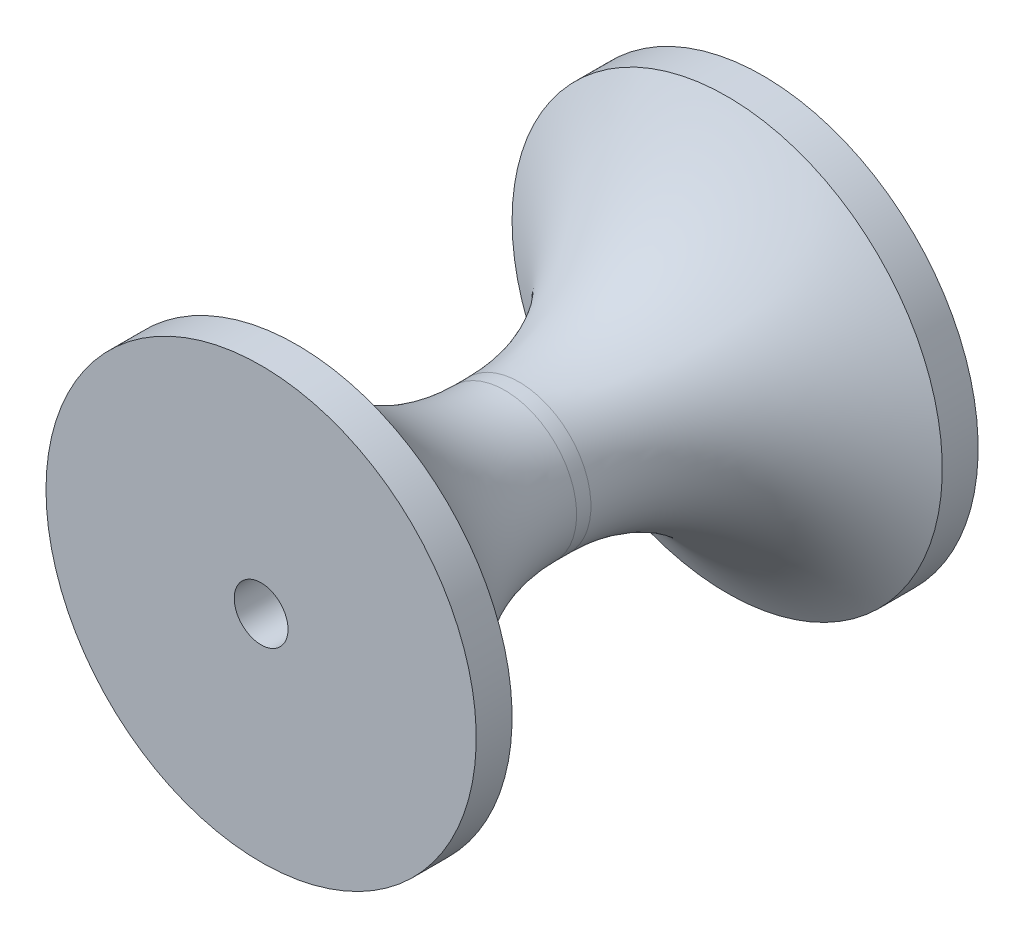
ISO-10303-21;
HEADER;
FILE_DESCRIPTION(('STEP AP214'),'2;1');
FILE_NAME('part.step','',(''),(''),'','','');
FILE_SCHEMA(('AUTOMOTIVE_DESIGN { 1 0 10303 214 1 1 1 1 }'));
ENDSEC;
DATA;
#1=APPLICATION_CONTEXT('core data for automotive mechanical design processes');
#2=APPLICATION_PROTOCOL_DEFINITION('international standard','automotive_design',2000,#1);
#3=PRODUCT_CONTEXT('',#1,'mechanical');
#4=PRODUCT('Part','Part','',(#3));
#5=PRODUCT_RELATED_PRODUCT_CATEGORY('part','',(#4));
#6=PRODUCT_DEFINITION_FORMATION('','',#4);
#7=PRODUCT_DEFINITION_CONTEXT('part definition',#1,'design');
#8=PRODUCT_DEFINITION('design','',#6,#7);
#9=PRODUCT_DEFINITION_SHAPE('','',#8);
#10=(LENGTH_UNIT() NAMED_UNIT(*) SI_UNIT(.MILLI.,.METRE.));
#11=(NAMED_UNIT(*) PLANE_ANGLE_UNIT() SI_UNIT($,.RADIAN.));
#12=(NAMED_UNIT(*) SI_UNIT($,.STERADIAN.) SOLID_ANGLE_UNIT());
#13=UNCERTAINTY_MEASURE_WITH_UNIT(LENGTH_MEASURE(1.E-05),#10,'distance_accuracy_value','');
#14=(GEOMETRIC_REPRESENTATION_CONTEXT(3) GLOBAL_UNCERTAINTY_ASSIGNED_CONTEXT((#13)) GLOBAL_UNIT_ASSIGNED_CONTEXT((#10,
#11,#12)) REPRESENTATION_CONTEXT('',''));
#15=CARTESIAN_POINT('',(0.,0.,0.));
#16=DIRECTION('',(0.,0.,1.));
#17=DIRECTION('',(1.,0.,0.));
#18=AXIS2_PLACEMENT_3D('',#15,#16,#17);
#19=CARTESIAN_POINT('',(0.,0.,-51.2368456443619));
#20=DIRECTION('',(0.,0.,-1.));
#21=DIRECTION('',(-1.,0.,0.));
#22=AXIS2_PLACEMENT_3D('',#19,#20,#21);
#23=CYLINDRICAL_SURFACE('',#22,12.7);
#24=CARTESIAN_POINT('',(0.,0.,-1.27));
#25=DIRECTION('',(0.,0.,-1.));
#26=DIRECTION('',(-1.,0.,0.));
#27=AXIS2_PLACEMENT_3D('',#24,#25,#26);
#28=CIRCLE('',#27,12.7);
#29=CARTESIAN_POINT('',(-12.7,0.,-1.27));
#30=VERTEX_POINT('',#29);
#31=EDGE_CURVE('E10',#30,#30,#28,.T.);
#32=ORIENTED_EDGE('',*,*,#31,.F.);
#33=EDGE_LOOP('',(#32));
#34=FACE_BOUND('',#33,.T.);
#35=CARTESIAN_POINT('',(0.,0.,1.27));
#36=DIRECTION('',(0.,0.,-1.));
#37=DIRECTION('',(-1.,0.,0.));
#38=AXIS2_PLACEMENT_3D('',#35,#36,#37);
#39=CIRCLE('',#38,12.7);
#40=CARTESIAN_POINT('',(-12.7,0.,1.27));
#41=VERTEX_POINT('',#40);
#42=EDGE_CURVE('E49',#41,#41,#39,.T.);
#43=ORIENTED_EDGE('',*,*,#42,.T.);
#44=EDGE_LOOP('',(#43));
#45=FACE_BOUND('',#44,.T.);
#46=ADVANCED_FACE('F35',(#34,#45),#23,.T.);
#47=CARTESIAN_POINT('',(0.,38.1,-38.1));
#48=CARTESIAN_POINT('',(0.,12.7,-23.6396667933533));
#49=CARTESIAN_POINT('',(0.,12.7,-1.27));
#50=B_SPLINE_CURVE_WITH_KNOTS('',2,(#47,#48,#49),.UNSPECIFIED.,.F.,.F.,(3,3),(0.,1.),.UNSPECIFIED.);
#51=CARTESIAN_POINT('',(0.,0.,-51.2368456443619));
#52=DIRECTION('',(0.,0.,-1.));
#53=AXIS1_PLACEMENT('',#51,#52);
#54=SURFACE_OF_REVOLUTION('',#50,#53);
#55=ORIENTED_EDGE('',*,*,#31,.T.);
#56=EDGE_LOOP('',(#55));
#57=FACE_BOUND('',#56,.T.);
#58=CARTESIAN_POINT('',(0.,0.,-38.1));
#59=DIRECTION('',(0.,0.,-1.));
#60=DIRECTION('',(-1.,0.,0.));
#61=AXIS2_PLACEMENT_3D('',#58,#59,#60);
#62=CIRCLE('',#61,38.1);
#63=CARTESIAN_POINT('',(-38.1,0.,-38.1));
#64=VERTEX_POINT('',#63);
#65=EDGE_CURVE('E41',#64,#64,#62,.T.);
#66=ORIENTED_EDGE('',*,*,#65,.F.);
#67=EDGE_LOOP('',(#66));
#68=FACE_BOUND('',#67,.T.);
#69=ADVANCED_FACE('F60',(#57,#68),#54,.F.);
#70=CARTESIAN_POINT('',(0.,0.,-51.2368456443619));
#71=DIRECTION('',(0.,0.,-1.));
#72=DIRECTION('',(-1.,0.,0.));
#73=AXIS2_PLACEMENT_3D('',#70,#71,#72);
#74=CYLINDRICAL_SURFACE('',#73,38.1);
#75=ORIENTED_EDGE('',*,*,#65,.T.);
#76=EDGE_LOOP('',(#75));
#77=FACE_BOUND('',#76,.T.);
#78=CARTESIAN_POINT('',(0.,0.,-44.45));
#79=DIRECTION('',(0.,0.,-1.));
#80=DIRECTION('',(-1.,0.,0.));
#81=AXIS2_PLACEMENT_3D('',#78,#79,#80);
#82=CIRCLE('',#81,38.1);
#83=CARTESIAN_POINT('',(-38.1,0.,-44.45));
#84=VERTEX_POINT('',#83);
#85=EDGE_CURVE('E45',#84,#84,#82,.T.);
#86=ORIENTED_EDGE('',*,*,#85,.F.);
#87=EDGE_LOOP('',(#86));
#88=FACE_BOUND('',#87,.T.);
#89=ADVANCED_FACE('F63',(#77,#88),#74,.T.);
#90=CARTESIAN_POINT('',(0.,38.1,-44.45));
#91=DIRECTION('',(0.,0.,-1.));
#92=DIRECTION('',(-1.,0.,0.));
#93=AXIS2_PLACEMENT_3D('',#90,#91,#92);
#94=PLANE('',#93);
#95=CARTESIAN_POINT('',(0.,0.,-44.45));
#96=DIRECTION('',(0.,0.,1.));
#97=DIRECTION('',(1.,0.,0.));
#98=AXIS2_PLACEMENT_3D('',#95,#96,#97);
#99=CIRCLE('',#98,4.7625);
#100=CARTESIAN_POINT('',(4.7625,0.,-44.45));
#101=VERTEX_POINT('',#100);
#102=EDGE_CURVE('E82',#101,#101,#99,.T.);
#103=ORIENTED_EDGE('',*,*,#102,.T.);
#104=EDGE_LOOP('',(#103));
#105=FACE_BOUND('',#104,.T.);
#106=ORIENTED_EDGE('',*,*,#85,.T.);
#107=EDGE_LOOP('',(#106));
#108=FACE_BOUND('',#107,.T.);
#109=ADVANCED_FACE('F66',(#105,#108),#94,.T.);
#110=CARTESIAN_POINT('',(0.,38.1,38.1));
#111=CARTESIAN_POINT('',(0.,12.7,23.6396667933533));
#112=CARTESIAN_POINT('',(0.,12.7,1.27));
#113=B_SPLINE_CURVE_WITH_KNOTS('',2,(#110,#111,#112),.UNSPECIFIED.,.F.,.F.,(3,3),(0.,1.),.UNSPECIFIED.);
#114=CARTESIAN_POINT('',(0.,0.,51.2368456443619));
#115=DIRECTION('',(0.,0.,1.));
#116=AXIS1_PLACEMENT('',#114,#115);
#117=SURFACE_OF_REVOLUTION('',#113,#116);
#118=ORIENTED_EDGE('',*,*,#42,.F.);
#119=EDGE_LOOP('',(#118));
#120=FACE_BOUND('',#119,.T.);
#121=CARTESIAN_POINT('',(0.,0.,38.1));
#122=DIRECTION('',(0.,0.,-1.));
#123=DIRECTION('',(-1.,0.,0.));
#124=AXIS2_PLACEMENT_3D('',#121,#122,#123);
#125=CIRCLE('',#124,38.1);
#126=CARTESIAN_POINT('',(-38.1,0.,38.1));
#127=VERTEX_POINT('',#126);
#128=EDGE_CURVE('E89',#127,#127,#125,.T.);
#129=ORIENTED_EDGE('',*,*,#128,.T.);
#130=EDGE_LOOP('',(#129));
#131=FACE_BOUND('',#130,.T.);
#132=ADVANCED_FACE('F69',(#120,#131),#117,.F.);
#133=CARTESIAN_POINT('',(0.,0.,51.2368456443619));
#134=DIRECTION('',(0.,0.,1.));
#135=DIRECTION('',(-1.,0.,0.));
#136=AXIS2_PLACEMENT_3D('',#133,#134,#135);
#137=CYLINDRICAL_SURFACE('',#136,38.1);
#138=ORIENTED_EDGE('',*,*,#128,.F.);
#139=EDGE_LOOP('',(#138));
#140=FACE_BOUND('',#139,.T.);
#141=CARTESIAN_POINT('',(0.,0.,44.45));
#142=DIRECTION('',(0.,0.,-1.));
#143=DIRECTION('',(-1.,0.,0.));
#144=AXIS2_PLACEMENT_3D('',#141,#142,#143);
#145=CIRCLE('',#144,38.1);
#146=CARTESIAN_POINT('',(-38.1,0.,44.45));
#147=VERTEX_POINT('',#146);
#148=EDGE_CURVE('E84',#147,#147,#145,.T.);
#149=ORIENTED_EDGE('',*,*,#148,.T.);
#150=EDGE_LOOP('',(#149));
#151=FACE_BOUND('',#150,.T.);
#152=ADVANCED_FACE('F74',(#140,#151),#137,.T.);
#153=CARTESIAN_POINT('',(0.,38.1,44.45));
#154=DIRECTION('',(0.,0.,1.));
#155=DIRECTION('',(-1.,0.,0.));
#156=AXIS2_PLACEMENT_3D('',#153,#154,#155);
#157=PLANE('',#156);
#158=CARTESIAN_POINT('',(0.,0.,44.45));
#159=DIRECTION('',(0.,0.,1.));
#160=DIRECTION('',(1.,0.,0.));
#161=AXIS2_PLACEMENT_3D('',#158,#159,#160);
#162=CIRCLE('',#161,4.7625);
#163=CARTESIAN_POINT('',(4.7625,0.,44.45));
#164=VERTEX_POINT('',#163);
#165=EDGE_CURVE('E163',#164,#164,#162,.T.);
#166=ORIENTED_EDGE('',*,*,#165,.F.);
#167=EDGE_LOOP('',(#166));
#168=FACE_BOUND('',#167,.T.);
#169=ORIENTED_EDGE('',*,*,#148,.F.);
#170=EDGE_LOOP('',(#169));
#171=FACE_BOUND('',#170,.T.);
#172=ADVANCED_FACE('F123',(#168,#171),#157,.T.);
#173=CARTESIAN_POINT('',(0.,0.,-44.45));
#174=DIRECTION('',(0.,0.,1.));
#175=DIRECTION('',(1.,0.,0.));
#176=AXIS2_PLACEMENT_3D('',#173,#174,#175);
#177=CYLINDRICAL_SURFACE('',#176,4.7625);
#178=ORIENTED_EDGE('',*,*,#102,.F.);
#179=EDGE_LOOP('',(#178));
#180=FACE_BOUND('',#179,.T.);
#181=ORIENTED_EDGE('',*,*,#165,.T.);
#182=EDGE_LOOP('',(#181));
#183=FACE_BOUND('',#182,.T.);
#184=ADVANCED_FACE('F129',(#180,#183),#177,.F.);
#185=CLOSED_SHELL('',(#46,#69,#89,#109,#132,#152,#172,#184));
#186=MANIFOLD_SOLID_BREP('B2',#185);
#187=ADVANCED_BREP_SHAPE_REPRESENTATION('',(#18,#186),#14);
#188=SHAPE_DEFINITION_REPRESENTATION(#9,#187);
ENDSEC;
END-ISO-10303-21;
